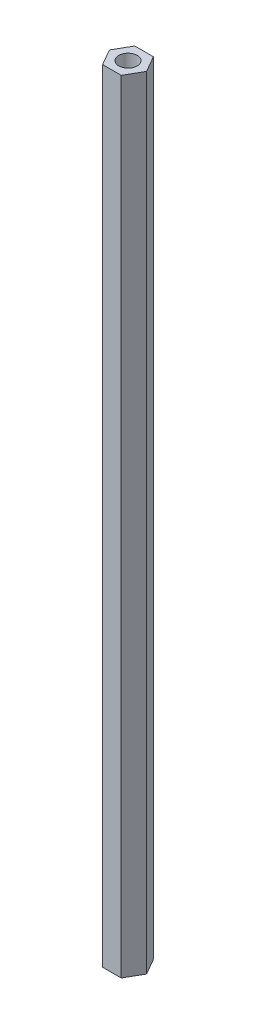
ISO-10303-21;
HEADER;
FILE_DESCRIPTION(('STEP AP214'),'2;1');
FILE_NAME('part.step','',(''),(''),'','','');
FILE_SCHEMA(('AUTOMOTIVE_DESIGN { 1 0 10303 214 1 1 1 1 }'));
ENDSEC;
DATA;
#1=APPLICATION_CONTEXT('core data for automotive mechanical design processes');
#2=APPLICATION_PROTOCOL_DEFINITION('international standard','automotive_design',2000,#1);
#3=PRODUCT_CONTEXT('',#1,'mechanical');
#4=PRODUCT('Part','Part','',(#3));
#5=PRODUCT_RELATED_PRODUCT_CATEGORY('part','',(#4));
#6=PRODUCT_DEFINITION_FORMATION('','',#4);
#7=PRODUCT_DEFINITION_CONTEXT('part definition',#1,'design');
#8=PRODUCT_DEFINITION('design','',#6,#7);
#9=PRODUCT_DEFINITION_SHAPE('','',#8);
#10=(LENGTH_UNIT() NAMED_UNIT(*) SI_UNIT(.MILLI.,.METRE.));
#11=(NAMED_UNIT(*) PLANE_ANGLE_UNIT() SI_UNIT($,.RADIAN.));
#12=(NAMED_UNIT(*) SI_UNIT($,.STERADIAN.) SOLID_ANGLE_UNIT());
#13=UNCERTAINTY_MEASURE_WITH_UNIT(LENGTH_MEASURE(1.E-05),#10,'distance_accuracy_value','');
#14=(GEOMETRIC_REPRESENTATION_CONTEXT(3) GLOBAL_UNCERTAINTY_ASSIGNED_CONTEXT((#13)) GLOBAL_UNIT_ASSIGNED_CONTEXT((#10,
#11,#12)) REPRESENTATION_CONTEXT('',''));
#15=CARTESIAN_POINT('',(0.,0.,0.));
#16=DIRECTION('',(0.,0.,1.));
#17=DIRECTION('',(1.,0.,0.));
#18=AXIS2_PLACEMENT_3D('',#15,#16,#17);
#19=CARTESIAN_POINT('',(0.,170.,0.));
#20=DIRECTION('',(0.,1.,0.));
#21=DIRECTION('',(0.,0.,1.));
#22=AXIS2_PLACEMENT_3D('',#19,#20,#21);
#23=PLANE('',#22);
#24=DIRECTION('',(0.499999999999999,0.,-0.866025403784439));
#25=VECTOR('',#24,1.);
#26=CARTESIAN_POINT('',(2.02072594216369,170.,3.5));
#27=LINE('',#26,#25);
#28=CARTESIAN_POINT('',(2.02072594216369,170.,3.5));
#29=VERTEX_POINT('',#28);
#30=CARTESIAN_POINT('',(4.04145188432738,170.,0.));
#31=VERTEX_POINT('',#30);
#32=EDGE_CURVE('E154',#29,#31,#27,.T.);
#33=ORIENTED_EDGE('',*,*,#32,.T.);
#34=DIRECTION('',(-0.5,0.,-0.866025403784438));
#35=VECTOR('',#34,1.);
#36=CARTESIAN_POINT('',(4.04145188432738,170.,0.));
#37=LINE('',#36,#35);
#38=CARTESIAN_POINT('',(2.02072594216369,170.,-3.5));
#39=VERTEX_POINT('',#38);
#40=EDGE_CURVE('E102',#31,#39,#37,.T.);
#41=ORIENTED_EDGE('',*,*,#40,.T.);
#42=DIRECTION('',(-1.,0.,0.));
#43=VECTOR('',#42,1.);
#44=CARTESIAN_POINT('',(2.02072594216369,170.,-3.5));
#45=LINE('',#44,#43);
#46=CARTESIAN_POINT('',(-2.02072594216369,170.,-3.5));
#47=VERTEX_POINT('',#46);
#48=EDGE_CURVE('E115',#39,#47,#45,.T.);
#49=ORIENTED_EDGE('',*,*,#48,.T.);
#50=DIRECTION('',(-0.5,0.,0.866025403784439));
#51=VECTOR('',#50,1.);
#52=CARTESIAN_POINT('',(-2.02072594216369,170.,-3.5));
#53=LINE('',#52,#51);
#54=CARTESIAN_POINT('',(-4.04145188432738,170.,0.));
#55=VERTEX_POINT('',#54);
#56=EDGE_CURVE('E109',#47,#55,#53,.T.);
#57=ORIENTED_EDGE('',*,*,#56,.T.);
#58=DIRECTION('',(0.5,0.,0.866025403784439));
#59=VECTOR('',#58,1.);
#60=CARTESIAN_POINT('',(-4.04145188432738,170.,0.));
#61=LINE('',#60,#59);
#62=CARTESIAN_POINT('',(-2.02072594216369,170.,3.5));
#63=VERTEX_POINT('',#62);
#64=EDGE_CURVE('E113',#55,#63,#61,.T.);
#65=ORIENTED_EDGE('',*,*,#64,.T.);
#66=DIRECTION('',(1.,0.,0.));
#67=VECTOR('',#66,1.);
#68=CARTESIAN_POINT('',(-2.02072594216369,170.,3.5));
#69=LINE('',#68,#67);
#70=EDGE_CURVE('E65',#63,#29,#69,.T.);
#71=ORIENTED_EDGE('',*,*,#70,.T.);
#72=EDGE_LOOP('',(#33,#41,#49,#57,#65,#71));
#73=FACE_BOUND('',#72,.T.);
#74=CARTESIAN_POINT('',(0.,170.,0.));
#75=DIRECTION('',(0.,1.,0.));
#76=DIRECTION('',(0.,0.,1.));
#77=AXIS2_PLACEMENT_3D('',#74,#75,#76);
#78=CIRCLE('',#77,2.);
#79=CARTESIAN_POINT('',(0.,170.,2.));
#80=VERTEX_POINT('',#79);
#81=EDGE_CURVE('E142',#80,#80,#78,.T.);
#82=ORIENTED_EDGE('',*,*,#81,.F.);
#83=EDGE_LOOP('',(#82));
#84=FACE_BOUND('',#83,.T.);
#85=ADVANCED_FACE('F47',(#73,#84),#23,.T.);
#86=CARTESIAN_POINT('',(0.,0.,0.));
#87=DIRECTION('',(0.,1.,0.));
#88=DIRECTION('',(0.,0.,1.));
#89=AXIS2_PLACEMENT_3D('',#86,#87,#88);
#90=PLANE('',#89);
#91=DIRECTION('',(0.499999999999999,0.,-0.866025403784439));
#92=VECTOR('',#91,1.);
#93=CARTESIAN_POINT('',(2.02072594216369,0.,3.5));
#94=LINE('',#93,#92);
#95=CARTESIAN_POINT('',(2.02072594216369,0.,3.5));
#96=VERTEX_POINT('',#95);
#97=CARTESIAN_POINT('',(4.04145188432738,0.,0.));
#98=VERTEX_POINT('',#97);
#99=EDGE_CURVE('E137',#96,#98,#94,.T.);
#100=ORIENTED_EDGE('',*,*,#99,.F.);
#101=DIRECTION('',(1.,0.,0.));
#102=VECTOR('',#101,1.);
#103=CARTESIAN_POINT('',(-2.02072594216369,0.,3.5));
#104=LINE('',#103,#102);
#105=CARTESIAN_POINT('',(-2.02072594216369,0.,3.5));
#106=VERTEX_POINT('',#105);
#107=EDGE_CURVE('E94',#106,#96,#104,.T.);
#108=ORIENTED_EDGE('',*,*,#107,.F.);
#109=DIRECTION('',(0.5,0.,0.866025403784439));
#110=VECTOR('',#109,1.);
#111=CARTESIAN_POINT('',(-4.04145188432738,0.,0.));
#112=LINE('',#111,#110);
#113=CARTESIAN_POINT('',(-4.04145188432738,0.,0.));
#114=VERTEX_POINT('',#113);
#115=EDGE_CURVE('E88',#114,#106,#112,.T.);
#116=ORIENTED_EDGE('',*,*,#115,.F.);
#117=DIRECTION('',(-0.5,0.,0.866025403784439));
#118=VECTOR('',#117,1.);
#119=CARTESIAN_POINT('',(-2.02072594216369,0.,-3.5));
#120=LINE('',#119,#118);
#121=CARTESIAN_POINT('',(-2.02072594216369,0.,-3.5));
#122=VERTEX_POINT('',#121);
#123=EDGE_CURVE('E124',#122,#114,#120,.T.);
#124=ORIENTED_EDGE('',*,*,#123,.F.);
#125=DIRECTION('',(-1.,0.,0.));
#126=VECTOR('',#125,1.);
#127=CARTESIAN_POINT('',(2.02072594216369,0.,-3.5));
#128=LINE('',#127,#126);
#129=CARTESIAN_POINT('',(2.02072594216369,0.,-3.5));
#130=VERTEX_POINT('',#129);
#131=EDGE_CURVE('E145',#130,#122,#128,.T.);
#132=ORIENTED_EDGE('',*,*,#131,.F.);
#133=DIRECTION('',(-0.5,0.,-0.866025403784438));
#134=VECTOR('',#133,1.);
#135=CARTESIAN_POINT('',(4.04145188432738,0.,0.));
#136=LINE('',#135,#134);
#137=EDGE_CURVE('E141',#98,#130,#136,.T.);
#138=ORIENTED_EDGE('',*,*,#137,.F.);
#139=EDGE_LOOP('',(#100,#108,#116,#124,#132,#138));
#140=FACE_BOUND('',#139,.T.);
#141=CARTESIAN_POINT('',(0.,0.,0.));
#142=DIRECTION('',(0.,1.,0.));
#143=DIRECTION('',(0.,0.,1.));
#144=AXIS2_PLACEMENT_3D('',#141,#142,#143);
#145=CIRCLE('',#144,2.);
#146=CARTESIAN_POINT('',(0.,0.,2.));
#147=VERTEX_POINT('',#146);
#148=EDGE_CURVE('E253',#147,#147,#145,.T.);
#149=ORIENTED_EDGE('',*,*,#148,.T.);
#150=EDGE_LOOP('',(#149));
#151=FACE_BOUND('',#150,.T.);
#152=ADVANCED_FACE('F167',(#140,#151),#90,.F.);
#153=CARTESIAN_POINT('',(2.02072594216369,170.,3.5));
#154=DIRECTION('',(-0.866025403784439,0.,-0.499999999999999));
#155=DIRECTION('',(-0.499999999999999,0.,0.866025403784439));
#156=AXIS2_PLACEMENT_3D('',#153,#154,#155);
#157=PLANE('',#156);
#158=ORIENTED_EDGE('',*,*,#99,.T.);
#159=DIRECTION('',(0.,-1.,0.));
#160=VECTOR('',#159,1.);
#161=CARTESIAN_POINT('',(4.04145188432738,170.,0.));
#162=LINE('',#161,#160);
#163=EDGE_CURVE('E11',#31,#98,#162,.T.);
#164=ORIENTED_EDGE('',*,*,#163,.F.);
#165=ORIENTED_EDGE('',*,*,#32,.F.);
#166=DIRECTION('',(0.,-1.,0.));
#167=VECTOR('',#166,1.);
#168=CARTESIAN_POINT('',(2.02072594216369,170.,3.5));
#169=LINE('',#168,#167);
#170=EDGE_CURVE('E133',#29,#96,#169,.T.);
#171=ORIENTED_EDGE('',*,*,#170,.T.);
#172=EDGE_LOOP('',(#158,#164,#165,#171));
#173=FACE_BOUND('',#172,.T.);
#174=ADVANCED_FACE('F49',(#173),#157,.F.);
#175=CARTESIAN_POINT('',(4.04145188432738,170.,0.));
#176=DIRECTION('',(-0.866025403784438,0.,0.5));
#177=DIRECTION('',(0.5,0.,0.866025403784438));
#178=AXIS2_PLACEMENT_3D('',#175,#176,#177);
#179=PLANE('',#178);
#180=ORIENTED_EDGE('',*,*,#137,.T.);
#181=DIRECTION('',(0.,-1.,0.));
#182=VECTOR('',#181,1.);
#183=CARTESIAN_POINT('',(2.02072594216369,170.,-3.5));
#184=LINE('',#183,#182);
#185=EDGE_CURVE('E57',#39,#130,#184,.T.);
#186=ORIENTED_EDGE('',*,*,#185,.F.);
#187=ORIENTED_EDGE('',*,*,#40,.F.);
#188=ORIENTED_EDGE('',*,*,#163,.T.);
#189=EDGE_LOOP('',(#180,#186,#187,#188));
#190=FACE_BOUND('',#189,.T.);
#191=ADVANCED_FACE('F192',(#190),#179,.F.);
#192=CARTESIAN_POINT('',(2.02072594216369,170.,-3.5));
#193=DIRECTION('',(0.,0.,1.));
#194=DIRECTION('',(1.,0.,0.));
#195=AXIS2_PLACEMENT_3D('',#192,#193,#194);
#196=PLANE('',#195);
#197=ORIENTED_EDGE('',*,*,#131,.T.);
#198=DIRECTION('',(0.,-1.,0.));
#199=VECTOR('',#198,1.);
#200=CARTESIAN_POINT('',(-2.02072594216369,170.,-3.5));
#201=LINE('',#200,#199);
#202=EDGE_CURVE('E126',#47,#122,#201,.T.);
#203=ORIENTED_EDGE('',*,*,#202,.F.);
#204=ORIENTED_EDGE('',*,*,#48,.F.);
#205=ORIENTED_EDGE('',*,*,#185,.T.);
#206=EDGE_LOOP('',(#197,#203,#204,#205));
#207=FACE_BOUND('',#206,.T.);
#208=ADVANCED_FACE('F164',(#207),#196,.F.);
#209=CARTESIAN_POINT('',(-2.02072594216369,170.,-3.5));
#210=DIRECTION('',(0.866025403784439,0.,0.5));
#211=DIRECTION('',(0.5,0.,-0.866025403784439));
#212=AXIS2_PLACEMENT_3D('',#209,#210,#211);
#213=PLANE('',#212);
#214=ORIENTED_EDGE('',*,*,#123,.T.);
#215=DIRECTION('',(0.,-1.,0.));
#216=VECTOR('',#215,1.);
#217=CARTESIAN_POINT('',(-4.04145188432738,170.,0.));
#218=LINE('',#217,#216);
#219=EDGE_CURVE('E121',#55,#114,#218,.T.);
#220=ORIENTED_EDGE('',*,*,#219,.F.);
#221=ORIENTED_EDGE('',*,*,#56,.F.);
#222=ORIENTED_EDGE('',*,*,#202,.T.);
#223=EDGE_LOOP('',(#214,#220,#221,#222));
#224=FACE_BOUND('',#223,.T.);
#225=ADVANCED_FACE('F122',(#224),#213,.F.);
#226=CARTESIAN_POINT('',(-4.04145188432738,170.,0.));
#227=DIRECTION('',(0.866025403784438,0.,-0.5));
#228=DIRECTION('',(-0.5,0.,-0.866025403784439));
#229=AXIS2_PLACEMENT_3D('',#226,#227,#228);
#230=PLANE('',#229);
#231=ORIENTED_EDGE('',*,*,#115,.T.);
#232=DIRECTION('',(0.,-1.,0.));
#233=VECTOR('',#232,1.);
#234=CARTESIAN_POINT('',(-2.02072594216369,170.,3.5));
#235=LINE('',#234,#233);
#236=EDGE_CURVE('E127',#63,#106,#235,.T.);
#237=ORIENTED_EDGE('',*,*,#236,.F.);
#238=ORIENTED_EDGE('',*,*,#64,.F.);
#239=ORIENTED_EDGE('',*,*,#219,.T.);
#240=EDGE_LOOP('',(#231,#237,#238,#239));
#241=FACE_BOUND('',#240,.T.);
#242=ADVANCED_FACE('F129',(#241),#230,.F.);
#243=CARTESIAN_POINT('',(-2.02072594216369,170.,3.5));
#244=DIRECTION('',(0.,0.,-1.));
#245=DIRECTION('',(-1.,0.,0.));
#246=AXIS2_PLACEMENT_3D('',#243,#244,#245);
#247=PLANE('',#246);
#248=ORIENTED_EDGE('',*,*,#107,.T.);
#249=ORIENTED_EDGE('',*,*,#170,.F.);
#250=ORIENTED_EDGE('',*,*,#70,.F.);
#251=ORIENTED_EDGE('',*,*,#236,.T.);
#252=EDGE_LOOP('',(#248,#249,#250,#251));
#253=FACE_BOUND('',#252,.T.);
#254=ADVANCED_FACE('F172',(#253),#247,.F.);
#255=CARTESIAN_POINT('',(0.,170.,0.));
#256=DIRECTION('',(0.,-1.,0.));
#257=DIRECTION('',(0.,0.,-1.));
#258=AXIS2_PLACEMENT_3D('',#255,#256,#257);
#259=CYLINDRICAL_SURFACE('',#258,2.);
#260=ORIENTED_EDGE('',*,*,#81,.T.);
#261=EDGE_LOOP('',(#260));
#262=FACE_BOUND('',#261,.T.);
#263=ORIENTED_EDGE('',*,*,#148,.F.);
#264=EDGE_LOOP('',(#263));
#265=FACE_BOUND('',#264,.T.);
#266=ADVANCED_FACE('F174',(#262,#265),#259,.F.);
#267=CLOSED_SHELL('',(#85,#152,#174,#191,#208,#225,#242,#254,#266));
#268=MANIFOLD_SOLID_BREP('B2',#267);
#269=ADVANCED_BREP_SHAPE_REPRESENTATION('',(#18,#268),#14);
#270=SHAPE_DEFINITION_REPRESENTATION(#9,#269);
ENDSEC;
END-ISO-10303-21;
